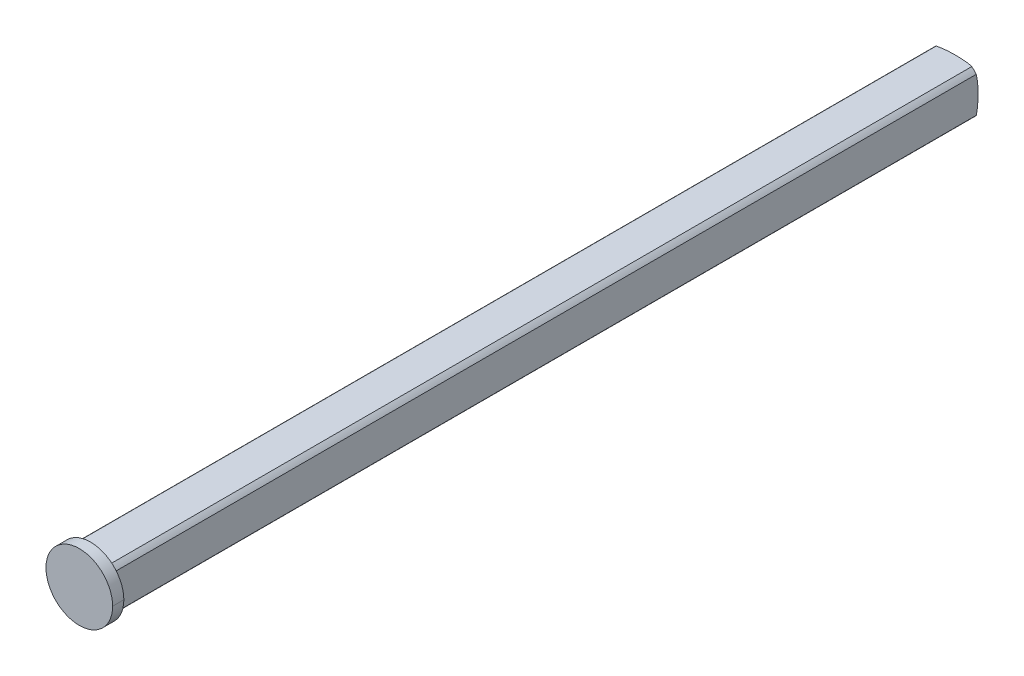
ISO-10303-21;
HEADER;
FILE_DESCRIPTION(('STEP AP214'),'2;1');
FILE_NAME('part.step','',(''),(''),'','','');
FILE_SCHEMA(('AUTOMOTIVE_DESIGN { 1 0 10303 214 1 1 1 1 }'));
ENDSEC;
DATA;
#1=APPLICATION_CONTEXT('core data for automotive mechanical design processes');
#2=APPLICATION_PROTOCOL_DEFINITION('international standard','automotive_design',2000,#1);
#3=PRODUCT_CONTEXT('',#1,'mechanical');
#4=PRODUCT('Part','Part','',(#3));
#5=PRODUCT_RELATED_PRODUCT_CATEGORY('part','',(#4));
#6=PRODUCT_DEFINITION_FORMATION('','',#4);
#7=PRODUCT_DEFINITION_CONTEXT('part definition',#1,'design');
#8=PRODUCT_DEFINITION('design','',#6,#7);
#9=PRODUCT_DEFINITION_SHAPE('','',#8);
#10=(LENGTH_UNIT() NAMED_UNIT(*) SI_UNIT(.MILLI.,.METRE.));
#11=(NAMED_UNIT(*) PLANE_ANGLE_UNIT() SI_UNIT($,.RADIAN.));
#12=(NAMED_UNIT(*) SI_UNIT($,.STERADIAN.) SOLID_ANGLE_UNIT());
#13=UNCERTAINTY_MEASURE_WITH_UNIT(LENGTH_MEASURE(1.E-05),#10,'distance_accuracy_value','');
#14=(GEOMETRIC_REPRESENTATION_CONTEXT(3) GLOBAL_UNCERTAINTY_ASSIGNED_CONTEXT((#13)) GLOBAL_UNIT_ASSIGNED_CONTEXT((#10,
#11,#12)) REPRESENTATION_CONTEXT('',''));
#15=CARTESIAN_POINT('',(0.,0.,0.));
#16=DIRECTION('',(0.,0.,1.));
#17=DIRECTION('',(1.,0.,0.));
#18=AXIS2_PLACEMENT_3D('',#15,#16,#17);
#19=CARTESIAN_POINT('',(0.,0.,-61.722));
#20=DIRECTION('',(0.,0.,1.));
#21=DIRECTION('',(1.,0.,0.));
#22=AXIS2_PLACEMENT_3D('',#19,#20,#21);
#23=CYLINDRICAL_SURFACE('',#22,2.032);
#24=DIRECTION('',(0.,0.,-1.));
#25=VECTOR('',#24,1.);
#26=CARTESIAN_POINT('',(1.5875,1.26841150657032,-61.722));
#27=LINE('',#26,#25);
#28=CARTESIAN_POINT('',(1.5875,1.26841150657032,0.));
#29=VERTEX_POINT('',#28);
#30=CARTESIAN_POINT('',(1.5875,1.26841150657032,-61.570919142098));
#31=VERTEX_POINT('',#30);
#32=EDGE_CURVE('P0_E405',#29,#31,#27,.T.);
#33=ORIENTED_EDGE('',*,*,#32,.T.);
#34=CARTESIAN_POINT('',(0.,0.,-61.570919142098));
#35=DIRECTION('',(0.,0.,1.));
#36=DIRECTION('',(1.,0.,0.));
#37=AXIS2_PLACEMENT_3D('',#34,#35,#36);
#38=CIRCLE('',#37,2.032);
#39=CARTESIAN_POINT('',(1.26841150657032,1.5875,-61.570919142098));
#40=VERTEX_POINT('',#39);
#41=EDGE_CURVE('P0_E386',#31,#40,#38,.T.);
#42=ORIENTED_EDGE('',*,*,#41,.T.);
#43=DIRECTION('',(0.,0.,1.));
#44=VECTOR('',#43,1.);
#45=CARTESIAN_POINT('',(1.26841150657032,1.5875,-61.722));
#46=LINE('',#45,#44);
#47=CARTESIAN_POINT('',(1.26841150657032,1.5875,0.));
#48=VERTEX_POINT('',#47);
#49=EDGE_CURVE('P0_E290',#40,#48,#46,.T.);
#50=ORIENTED_EDGE('',*,*,#49,.T.);
#51=CARTESIAN_POINT('',(0.,0.,0.));
#52=DIRECTION('',(0.,0.,1.));
#53=DIRECTION('',(1.,0.,0.));
#54=AXIS2_PLACEMENT_3D('',#51,#52,#53);
#55=CIRCLE('',#54,2.032);
#56=EDGE_CURVE('P0_E384',#29,#48,#55,.T.);
#57=ORIENTED_EDGE('',*,*,#56,.F.);
#58=EDGE_LOOP('',(#33,#42,#50,#57));
#59=FACE_BOUND('',#58,.T.);
#60=ADVANCED_FACE('P0_F17',(#59),#23,.T.);
#61=CARTESIAN_POINT('',(0.,0.,-61.722));
#62=DIRECTION('',(0.,0.,1.));
#63=DIRECTION('',(1.,0.,0.));
#64=AXIS2_PLACEMENT_3D('',#61,#62,#63);
#65=CYLINDRICAL_SURFACE('',#64,2.032);
#66=DIRECTION('',(0.,0.,1.));
#67=VECTOR('',#66,1.);
#68=CARTESIAN_POINT('',(-1.5875,1.26841150657032,-61.722));
#69=LINE('',#68,#67);
#70=CARTESIAN_POINT('',(-1.5875,1.26841150657032,-61.570919142098));
#71=VERTEX_POINT('',#70);
#72=CARTESIAN_POINT('',(-1.5875,1.26841150657032,0.));
#73=VERTEX_POINT('',#72);
#74=EDGE_CURVE('P0_E180',#71,#73,#69,.T.);
#75=ORIENTED_EDGE('',*,*,#74,.T.);
#76=CARTESIAN_POINT('',(0.,0.,0.));
#77=DIRECTION('',(0.,0.,1.));
#78=DIRECTION('',(1.,0.,0.));
#79=AXIS2_PLACEMENT_3D('',#76,#77,#78);
#80=CIRCLE('',#79,2.032);
#81=CARTESIAN_POINT('',(-1.26841150657032,1.5875,0.));
#82=VERTEX_POINT('',#81);
#83=EDGE_CURVE('P0_E42',#82,#73,#80,.T.);
#84=ORIENTED_EDGE('',*,*,#83,.F.);
#85=DIRECTION('',(0.,0.,-1.));
#86=VECTOR('',#85,1.);
#87=CARTESIAN_POINT('',(-1.26841150657032,1.5875,-61.722));
#88=LINE('',#87,#86);
#89=CARTESIAN_POINT('',(-1.26841150657032,1.5875,-61.570919142098));
#90=VERTEX_POINT('',#89);
#91=EDGE_CURVE('P0_E412',#82,#90,#88,.T.);
#92=ORIENTED_EDGE('',*,*,#91,.T.);
#93=CARTESIAN_POINT('',(0.,0.,-61.570919142098));
#94=DIRECTION('',(0.,0.,1.));
#95=DIRECTION('',(1.,0.,0.));
#96=AXIS2_PLACEMENT_3D('',#93,#94,#95);
#97=CIRCLE('',#96,2.032);
#98=EDGE_CURVE('P0_E325',#90,#71,#97,.T.);
#99=ORIENTED_EDGE('',*,*,#98,.T.);
#100=EDGE_LOOP('',(#75,#84,#92,#99));
#101=FACE_BOUND('',#100,.T.);
#102=ADVANCED_FACE('P0_F298',(#101),#65,.T.);
#103=CARTESIAN_POINT('',(0.,0.,-61.722));
#104=DIRECTION('',(0.,0.,1.));
#105=DIRECTION('',(1.,0.,0.));
#106=AXIS2_PLACEMENT_3D('',#103,#104,#105);
#107=CYLINDRICAL_SURFACE('',#106,2.032);
#108=DIRECTION('',(0.,0.,-1.));
#109=VECTOR('',#108,1.);
#110=CARTESIAN_POINT('',(-1.5875,-1.26841150657032,-61.722));
#111=LINE('',#110,#109);
#112=CARTESIAN_POINT('',(-1.5875,-1.26841150657032,0.));
#113=VERTEX_POINT('',#112);
#114=CARTESIAN_POINT('',(-1.5875,-1.26841150657032,-61.570919142098));
#115=VERTEX_POINT('',#114);
#116=EDGE_CURVE('P0_E160',#113,#115,#111,.T.);
#117=ORIENTED_EDGE('',*,*,#116,.T.);
#118=CARTESIAN_POINT('',(0.,0.,-61.570919142098));
#119=DIRECTION('',(0.,0.,1.));
#120=DIRECTION('',(1.,0.,0.));
#121=AXIS2_PLACEMENT_3D('',#118,#119,#120);
#122=CIRCLE('',#121,2.032);
#123=CARTESIAN_POINT('',(-1.26841150657032,-1.5875,-61.570919142098));
#124=VERTEX_POINT('',#123);
#125=EDGE_CURVE('P0_E11',#115,#124,#122,.T.);
#126=ORIENTED_EDGE('',*,*,#125,.T.);
#127=DIRECTION('',(0.,0.,1.));
#128=VECTOR('',#127,1.);
#129=CARTESIAN_POINT('',(-1.26841150657032,-1.5875,-61.722));
#130=LINE('',#129,#128);
#131=CARTESIAN_POINT('',(-1.26841150657032,-1.5875,0.));
#132=VERTEX_POINT('',#131);
#133=EDGE_CURVE('P0_E159',#124,#132,#130,.T.);
#134=ORIENTED_EDGE('',*,*,#133,.T.);
#135=CARTESIAN_POINT('',(0.,0.,0.));
#136=DIRECTION('',(0.,0.,1.));
#137=DIRECTION('',(1.,0.,0.));
#138=AXIS2_PLACEMENT_3D('',#135,#136,#137);
#139=CIRCLE('',#138,2.032);
#140=EDGE_CURVE('P0_E143',#113,#132,#139,.T.);
#141=ORIENTED_EDGE('',*,*,#140,.F.);
#142=EDGE_LOOP('',(#117,#126,#134,#141));
#143=FACE_BOUND('',#142,.T.);
#144=ADVANCED_FACE('P0_F154',(#143),#107,.T.);
#145=CARTESIAN_POINT('',(0.,0.,-61.722));
#146=DIRECTION('',(0.,0.,1.));
#147=DIRECTION('',(1.,0.,0.));
#148=AXIS2_PLACEMENT_3D('',#145,#146,#147);
#149=CYLINDRICAL_SURFACE('',#148,2.032);
#150=DIRECTION('',(0.,0.,-1.));
#151=VECTOR('',#150,1.);
#152=CARTESIAN_POINT('',(1.26841150657032,-1.5875,-61.722));
#153=LINE('',#152,#151);
#154=CARTESIAN_POINT('',(1.26841150657032,-1.5875,0.));
#155=VERTEX_POINT('',#154);
#156=CARTESIAN_POINT('',(1.26841150657032,-1.5875,-61.570919142098));
#157=VERTEX_POINT('',#156);
#158=EDGE_CURVE('P0_E356',#155,#157,#153,.T.);
#159=ORIENTED_EDGE('',*,*,#158,.T.);
#160=CARTESIAN_POINT('',(0.,0.,-61.570919142098));
#161=DIRECTION('',(0.,0.,1.));
#162=DIRECTION('',(1.,0.,0.));
#163=AXIS2_PLACEMENT_3D('',#160,#161,#162);
#164=CIRCLE('',#163,2.032);
#165=CARTESIAN_POINT('',(1.5875,-1.26841150657032,-61.570919142098));
#166=VERTEX_POINT('',#165);
#167=EDGE_CURVE('P0_E26',#157,#166,#164,.T.);
#168=ORIENTED_EDGE('',*,*,#167,.T.);
#169=DIRECTION('',(0.,0.,1.));
#170=VECTOR('',#169,1.);
#171=CARTESIAN_POINT('',(1.5875,-1.26841150657032,-61.722));
#172=LINE('',#171,#170);
#173=CARTESIAN_POINT('',(1.5875,-1.26841150657032,0.));
#174=VERTEX_POINT('',#173);
#175=EDGE_CURVE('P0_E240',#166,#174,#172,.T.);
#176=ORIENTED_EDGE('',*,*,#175,.T.);
#177=CARTESIAN_POINT('',(0.,0.,0.));
#178=DIRECTION('',(0.,0.,1.));
#179=DIRECTION('',(1.,0.,0.));
#180=AXIS2_PLACEMENT_3D('',#177,#178,#179);
#181=CIRCLE('',#180,2.032);
#182=EDGE_CURVE('P0_E125',#155,#174,#181,.T.);
#183=ORIENTED_EDGE('',*,*,#182,.F.);
#184=EDGE_LOOP('',(#159,#168,#176,#183));
#185=FACE_BOUND('',#184,.T.);
#186=ADVANCED_FACE('P0_F299',(#185),#149,.T.);
#187=CARTESIAN_POINT('',(-1.5875,1.5875,-61.722));
#188=DIRECTION('',(0.,0.,-1.));
#189=DIRECTION('',(0.,-1.,0.));
#190=AXIS2_PLACEMENT_3D('',#187,#188,#189);
#191=PLANE('',#190);
#192=CARTESIAN_POINT('',(0.,0.,-61.722));
#193=DIRECTION('',(0.,0.,1.));
#194=DIRECTION('',(1.,0.,0.));
#195=AXIS2_PLACEMENT_3D('',#192,#193,#194);
#196=CIRCLE('',#195,1.24506403026729);
#197=CARTESIAN_POINT('',(1.24506403026729,0.,-61.722));
#198=VERTEX_POINT('',#197);
#199=CARTESIAN_POINT('',(-1.24506403026729,0.,-61.722));
#200=VERTEX_POINT('',#199);
#201=EDGE_CURVE('P0_E329',#198,#200,#196,.T.);
#202=ORIENTED_EDGE('',*,*,#201,.F.);
#203=CARTESIAN_POINT('',(0.,0.,-61.722));
#204=DIRECTION('',(0.,0.,1.));
#205=DIRECTION('',(1.,0.,0.));
#206=AXIS2_PLACEMENT_3D('',#203,#204,#205);
#207=CIRCLE('',#206,1.24506403026729);
#208=EDGE_CURVE('P0_E62',#200,#198,#207,.T.);
#209=ORIENTED_EDGE('',*,*,#208,.F.);
#210=EDGE_LOOP('',(#202,#209));
#211=FACE_BOUND('',#210,.T.);
#212=ADVANCED_FACE('P0_F209',(#211),#191,.T.);
#213=CARTESIAN_POINT('',(0.,0.,-59.597));
#214=DIRECTION('',(0.,0.,1.));
#215=DIRECTION('',(1.,0.,0.));
#216=AXIS2_PLACEMENT_3D('',#213,#214,#215);
#217=DEGENERATE_TOROIDAL_SURFACE('',#216,1.24506403026729,2.125,.T.);
#218=CARTESIAN_POINT('',(-1.24506403026729,0.,-59.597));
#219=DIRECTION('',(0.,1.,0.));
#220=DIRECTION('',(-1.,0.,0.));
#221=AXIS2_PLACEMENT_3D('',#218,#219,#220);
#222=CIRCLE('',#221,2.125);
#223=CARTESIAN_POINT('',(-1.5875,0.,-61.6942273616929));
#224=VERTEX_POINT('',#223);
#225=EDGE_CURVE('P0_E330',#200,#224,#222,.T.);
#226=ORIENTED_EDGE('',*,*,#225,.F.);
#227=ORIENTED_EDGE('',*,*,#208,.T.);
#228=CARTESIAN_POINT('',(1.24506403026729,0.,-59.597));
#229=DIRECTION('',(0.,-1.,0.));
#230=DIRECTION('',(0.,0.,-1.));
#231=AXIS2_PLACEMENT_3D('',#228,#229,#230);
#232=CIRCLE('',#231,2.125);
#233=CARTESIAN_POINT('',(1.5875,0.,-61.6942273616929));
#234=VERTEX_POINT('',#233);
#235=EDGE_CURVE('P0_E241',#198,#234,#232,.T.);
#236=ORIENTED_EDGE('',*,*,#235,.T.);
#237=CARTESIAN_POINT('',(1.5875,-1.26841150657032,-61.570919142098));
#238=CARTESIAN_POINT('',(1.5875,-0.987077094955513,-61.6409306391243));
#239=CARTESIAN_POINT('',(1.5875,-0.639530459017569,-61.6701819538897));
#240=CARTESIAN_POINT('',(1.5875,-0.353837297572186,-61.6942273616929));
#241=CARTESIAN_POINT('',(1.5875,0.,-61.6942273616929));
#242=B_SPLINE_CURVE_WITH_KNOTS('',2,(#237,#238,#239,#240,#241),.UNSPECIFIED.,.F.,.F.,(3,2,3),
(0.,0.5,1.),.UNSPECIFIED.);
#243=EDGE_CURVE('P0_E108',#166,#234,#242,.T.);
#244=ORIENTED_EDGE('',*,*,#243,.F.);
#245=ORIENTED_EDGE('',*,*,#167,.F.);
#246=CARTESIAN_POINT('',(-1.26841150657032,-1.5875,-61.570919142098));
#247=CARTESIAN_POINT('',(-0.770338232200926,-1.5875,-61.6948672057821));
#248=CARTESIAN_POINT('',(0.00849337593367507,-1.5875,-61.6942236517903));
#249=CARTESIAN_POINT('',(0.775470990407875,-1.5875,-61.6935898928361));
#250=CARTESIAN_POINT('',(1.26841150657033,-1.5875,-61.570919142098));
#251=B_SPLINE_CURVE_WITH_KNOTS('',2,(#246,#247,#248,#249,#250),.UNSPECIFIED.,.F.,.F.,(3,2,3),
(0.,0.5,1.),.UNSPECIFIED.);
#252=EDGE_CURVE('P0_E249',#124,#157,#251,.T.);
#253=ORIENTED_EDGE('',*,*,#252,.F.);
#254=ORIENTED_EDGE('',*,*,#125,.F.);
#255=CARTESIAN_POINT('',(-1.5875,0.,-61.6942273616929));
#256=CARTESIAN_POINT('',(-1.5875,-0.35317995741376,-61.6942273616929));
#257=CARTESIAN_POINT('',(-1.5875,-0.639529322286499,-61.6701820494506));
#258=CARTESIAN_POINT('',(-1.5875,-0.986669843252497,-61.6410319857783));
#259=CARTESIAN_POINT('',(-1.5875,-1.26841150657032,-61.570919142098));
#260=B_SPLINE_CURVE_WITH_KNOTS('',2,(#255,#256,#257,#258,#259),.UNSPECIFIED.,.F.,.F.,(3,2,3),
(0.,0.5,1.),.UNSPECIFIED.);
#261=EDGE_CURVE('P0_E168',#224,#115,#260,.T.);
#262=ORIENTED_EDGE('',*,*,#261,.F.);
#263=EDGE_LOOP('',(#226,#227,#236,#244,#245,#253,#254,#262));
#264=FACE_BOUND('',#263,.T.);
#265=ADVANCED_FACE('P0_F19',(#264),#217,.T.);
#266=CARTESIAN_POINT('',(-1.5875,1.5875,0.));
#267=DIRECTION('',(0.,0.,-1.));
#268=DIRECTION('',(0.,-1.,0.));
#269=AXIS2_PLACEMENT_3D('',#266,#267,#268);
#270=PLANE('',#269);
#271=ORIENTED_EDGE('',*,*,#83,.T.);
#272=DIRECTION('',(0.,-1.,0.));
#273=VECTOR('',#272,1.);
#274=CARTESIAN_POINT('',(-1.5875,-1.5875,0.));
#275=LINE('',#274,#273);
#276=EDGE_CURVE('P0_E162',#73,#113,#275,.T.);
#277=ORIENTED_EDGE('',*,*,#276,.T.);
#278=ORIENTED_EDGE('',*,*,#140,.T.);
#279=DIRECTION('',(1.,0.,0.));
#280=VECTOR('',#279,1.);
#281=CARTESIAN_POINT('',(-1.5875,-1.5875,0.));
#282=LINE('',#281,#280);
#283=EDGE_CURVE('P0_E238',#132,#155,#282,.T.);
#284=ORIENTED_EDGE('',*,*,#283,.T.);
#285=ORIENTED_EDGE('',*,*,#182,.T.);
#286=DIRECTION('',(0.,1.,0.));
#287=VECTOR('',#286,1.);
#288=CARTESIAN_POINT('',(1.5875,-1.5875,0.));
#289=LINE('',#288,#287);
#290=EDGE_CURVE('P0_E404',#174,#29,#289,.T.);
#291=ORIENTED_EDGE('',*,*,#290,.T.);
#292=ORIENTED_EDGE('',*,*,#56,.T.);
#293=DIRECTION('',(-1.,0.,0.));
#294=VECTOR('',#293,1.);
#295=CARTESIAN_POINT('',(-1.5875,1.5875,0.));
#296=LINE('',#295,#294);
#297=EDGE_CURVE('P0_E416',#48,#82,#296,.T.);
#298=ORIENTED_EDGE('',*,*,#297,.T.);
#299=EDGE_LOOP('',(#271,#277,#278,#284,#285,#291,#292,#298));
#300=FACE_BOUND('',#299,.T.);
#301=ADVANCED_FACE('P0_F163',(#300),#270,.F.);
#302=CARTESIAN_POINT('',(-1.5875,1.5875,0.));
#303=DIRECTION('',(0.,-1.,0.));
#304=DIRECTION('',(0.,0.,-1.));
#305=AXIS2_PLACEMENT_3D('',#302,#303,#304);
#306=PLANE('',#305);
#307=ORIENTED_EDGE('',*,*,#49,.F.);
#308=CARTESIAN_POINT('',(1.26841150657033,1.5875,-61.570919142098));
#309=CARTESIAN_POINT('',(0.770338232200925,1.5875,-61.6948672057821));
#310=CARTESIAN_POINT('',(-0.00849337593367486,1.5875,-61.6942236517903));
#311=CARTESIAN_POINT('',(-0.775470990407872,1.5875,-61.6935898928361));
#312=CARTESIAN_POINT('',(-1.26841150657032,1.5875,-61.570919142098));
#313=B_SPLINE_CURVE_WITH_KNOTS('',2,(#308,#309,#310,#311,#312),.UNSPECIFIED.,.F.,.F.,(3,2,3),
(0.,0.5,1.),.UNSPECIFIED.);
#314=EDGE_CURVE('P0_E283',#40,#90,#313,.T.);
#315=ORIENTED_EDGE('',*,*,#314,.T.);
#316=ORIENTED_EDGE('',*,*,#91,.F.);
#317=ORIENTED_EDGE('',*,*,#297,.F.);
#318=EDGE_LOOP('',(#307,#315,#316,#317));
#319=FACE_BOUND('',#318,.T.);
#320=ADVANCED_FACE('P0_F210',(#319),#306,.F.);
#321=CARTESIAN_POINT('',(1.5875,-1.5875,0.));
#322=DIRECTION('',(-1.,0.,0.));
#323=DIRECTION('',(0.,0.,1.));
#324=AXIS2_PLACEMENT_3D('',#321,#322,#323);
#325=PLANE('',#324);
#326=ORIENTED_EDGE('',*,*,#175,.F.);
#327=ORIENTED_EDGE('',*,*,#243,.T.);
#328=CARTESIAN_POINT('',(1.5875,0.,-61.6942273616929));
#329=CARTESIAN_POINT('',(1.5875,0.35317995741354,-61.6942273616929));
#330=CARTESIAN_POINT('',(1.5875,0.6395293222865,-61.6701820494506));
#331=CARTESIAN_POINT('',(1.5875,0.986669843252375,-61.6410319857783));
#332=CARTESIAN_POINT('',(1.5875,1.26841150657033,-61.570919142098));
#333=B_SPLINE_CURVE_WITH_KNOTS('',2,(#328,#329,#330,#331,#332),.UNSPECIFIED.,.F.,.F.,(3,2,3),
(0.,0.5,1.),.UNSPECIFIED.);
#334=EDGE_CURVE('P0_E188',#234,#31,#333,.T.);
#335=ORIENTED_EDGE('',*,*,#334,.T.);
#336=ORIENTED_EDGE('',*,*,#32,.F.);
#337=ORIENTED_EDGE('',*,*,#290,.F.);
#338=EDGE_LOOP('',(#326,#327,#335,#336,#337));
#339=FACE_BOUND('',#338,.T.);
#340=ADVANCED_FACE('P0_F198',(#339),#325,.F.);
#341=CARTESIAN_POINT('',(-1.5875,-1.5875,0.));
#342=DIRECTION('',(0.,1.,0.));
#343=DIRECTION('',(1.,0.,0.));
#344=AXIS2_PLACEMENT_3D('',#341,#342,#343);
#345=PLANE('',#344);
#346=ORIENTED_EDGE('',*,*,#133,.F.);
#347=ORIENTED_EDGE('',*,*,#252,.T.);
#348=ORIENTED_EDGE('',*,*,#158,.F.);
#349=ORIENTED_EDGE('',*,*,#283,.F.);
#350=EDGE_LOOP('',(#346,#347,#348,#349));
#351=FACE_BOUND('',#350,.T.);
#352=ADVANCED_FACE('P0_F206',(#351),#345,.F.);
#353=CARTESIAN_POINT('',(-1.5875,-1.5875,0.));
#354=DIRECTION('',(1.,0.,0.));
#355=DIRECTION('',(0.,1.,0.));
#356=AXIS2_PLACEMENT_3D('',#353,#354,#355);
#357=PLANE('',#356);
#358=ORIENTED_EDGE('',*,*,#74,.F.);
#359=CARTESIAN_POINT('',(-1.5875,1.26841150657033,-61.570919142098));
#360=CARTESIAN_POINT('',(-1.5875,0.987077094928485,-61.640930639131));
#361=CARTESIAN_POINT('',(-1.5875,0.63953045901757,-61.6701819538897));
#362=CARTESIAN_POINT('',(-1.5875,0.353837297528325,-61.6942273616929));
#363=CARTESIAN_POINT('',(-1.5875,0.,-61.6942273616929));
#364=B_SPLINE_CURVE_WITH_KNOTS('',2,(#359,#360,#361,#362,#363),.UNSPECIFIED.,.F.,.F.,(3,2,3),
(0.,0.5,1.),.UNSPECIFIED.);
#365=EDGE_CURVE('P0_E323',#71,#224,#364,.T.);
#366=ORIENTED_EDGE('',*,*,#365,.T.);
#367=ORIENTED_EDGE('',*,*,#261,.T.);
#368=ORIENTED_EDGE('',*,*,#116,.F.);
#369=ORIENTED_EDGE('',*,*,#276,.F.);
#370=EDGE_LOOP('',(#358,#366,#367,#368,#369));
#371=FACE_BOUND('',#370,.T.);
#372=ADVANCED_FACE('P0_F169',(#371),#357,.F.);
#373=CARTESIAN_POINT('',(0.,0.,-59.597));
#374=DIRECTION('',(0.,0.,1.));
#375=DIRECTION('',(1.,0.,0.));
#376=AXIS2_PLACEMENT_3D('',#373,#374,#375);
#377=DEGENERATE_TOROIDAL_SURFACE('',#376,1.24506403026729,2.125,.T.);
#378=ORIENTED_EDGE('',*,*,#201,.T.);
#379=ORIENTED_EDGE('',*,*,#225,.T.);
#380=ORIENTED_EDGE('',*,*,#365,.F.);
#381=ORIENTED_EDGE('',*,*,#98,.F.);
#382=ORIENTED_EDGE('',*,*,#314,.F.);
#383=ORIENTED_EDGE('',*,*,#41,.F.);
#384=ORIENTED_EDGE('',*,*,#334,.F.);
#385=ORIENTED_EDGE('',*,*,#235,.F.);
#386=EDGE_LOOP('',(#378,#379,#380,#381,#382,#383,#384,#385));
#387=FACE_BOUND('',#386,.T.);
#388=ADVANCED_FACE('P0_F295',(#387),#377,.T.);
#389=CLOSED_SHELL('',(#60,#102,#144,#186,#212,#265,#301,#320,#340,#352,#372,#388));
#390=MANIFOLD_SOLID_BREP('P0_B1',#389);
#391=CARTESIAN_POINT('',(0.,0.,0.));
#392=DIRECTION('',(0.,0.,1.));
#393=DIRECTION('',(1.,0.,0.));
#394=AXIS2_PLACEMENT_3D('',#391,#392,#393);
#395=PLANE('',#394);
#396=CARTESIAN_POINT('',(0.,0.,0.));
#397=DIRECTION('',(0.,0.,1.));
#398=DIRECTION('',(1.,0.,0.));
#399=AXIS2_PLACEMENT_3D('',#396,#397,#398);
#400=CIRCLE('',#399,2.375);
#401=CARTESIAN_POINT('',(-2.375,0.,0.));
#402=VERTEX_POINT('',#401);
#403=CARTESIAN_POINT('',(2.375,0.,0.));
#404=VERTEX_POINT('',#403);
#405=EDGE_CURVE('P1_E10',#402,#404,#400,.T.);
#406=ORIENTED_EDGE('',*,*,#405,.F.);
#407=CARTESIAN_POINT('',(0.,0.,0.));
#408=DIRECTION('',(0.,0.,1.));
#409=DIRECTION('',(1.,0.,0.));
#410=AXIS2_PLACEMENT_3D('',#407,#408,#409);
#411=CIRCLE('',#410,2.375);
#412=EDGE_CURVE('P1_E65',#404,#402,#411,.T.);
#413=ORIENTED_EDGE('',*,*,#412,.F.);
#414=EDGE_LOOP('',(#406,#413));
#415=FACE_BOUND('',#414,.T.);
#416=ADVANCED_FACE('P1_F16',(#415),#395,.F.);
#417=CARTESIAN_POINT('',(0.,0.,0.8));
#418=DIRECTION('',(0.,0.,1.));
#419=DIRECTION('',(1.,0.,0.));
#420=AXIS2_PLACEMENT_3D('',#417,#418,#419);
#421=PLANE('',#420);
#422=CARTESIAN_POINT('',(0.,0.,0.8));
#423=DIRECTION('',(0.,0.,1.));
#424=DIRECTION('',(1.,0.,0.));
#425=AXIS2_PLACEMENT_3D('',#422,#423,#424);
#426=CIRCLE('',#425,2.375);
#427=CARTESIAN_POINT('',(-2.375,0.,0.8));
#428=VERTEX_POINT('',#427);
#429=CARTESIAN_POINT('',(2.375,0.,0.8));
#430=VERTEX_POINT('',#429);
#431=EDGE_CURVE('P1_E20',#428,#430,#426,.T.);
#432=ORIENTED_EDGE('',*,*,#431,.T.);
#433=CARTESIAN_POINT('',(0.,0.,0.8));
#434=DIRECTION('',(0.,0.,1.));
#435=DIRECTION('',(1.,0.,0.));
#436=AXIS2_PLACEMENT_3D('',#433,#434,#435);
#437=CIRCLE('',#436,2.375);
#438=EDGE_CURVE('P1_E63',#430,#428,#437,.T.);
#439=ORIENTED_EDGE('',*,*,#438,.T.);
#440=EDGE_LOOP('',(#432,#439));
#441=FACE_BOUND('',#440,.T.);
#442=ADVANCED_FACE('P1_F69',(#441),#421,.T.);
#443=CARTESIAN_POINT('',(0.,0.,0.8));
#444=DIRECTION('',(0.,0.,-1.));
#445=DIRECTION('',(-1.,0.,0.));
#446=AXIS2_PLACEMENT_3D('',#443,#444,#445);
#447=CYLINDRICAL_SURFACE('',#446,2.375);
#448=DIRECTION('',(0.,0.,-1.));
#449=VECTOR('',#448,1.);
#450=CARTESIAN_POINT('',(2.375,0.,0.8));
#451=LINE('',#450,#449);
#452=EDGE_CURVE('P1_E56',#430,#404,#451,.T.);
#453=ORIENTED_EDGE('',*,*,#452,.F.);
#454=ORIENTED_EDGE('',*,*,#431,.F.);
#455=DIRECTION('',(0.,0.,-1.));
#456=VECTOR('',#455,1.);
#457=CARTESIAN_POINT('',(-2.375,0.,0.8));
#458=LINE('',#457,#456);
#459=EDGE_CURVE('P1_E57',#428,#402,#458,.T.);
#460=ORIENTED_EDGE('',*,*,#459,.T.);
#461=ORIENTED_EDGE('',*,*,#405,.T.);
#462=EDGE_LOOP('',(#453,#454,#460,#461));
#463=FACE_BOUND('',#462,.T.);
#464=ADVANCED_FACE('P1_F18',(#463),#447,.T.);
#465=CARTESIAN_POINT('',(0.,0.,0.8));
#466=DIRECTION('',(0.,0.,-1.));
#467=DIRECTION('',(-1.,0.,0.));
#468=AXIS2_PLACEMENT_3D('',#465,#466,#467);
#469=CYLINDRICAL_SURFACE('',#468,2.375);
#470=ORIENTED_EDGE('',*,*,#438,.F.);
#471=ORIENTED_EDGE('',*,*,#452,.T.);
#472=ORIENTED_EDGE('',*,*,#412,.T.);
#473=ORIENTED_EDGE('',*,*,#459,.F.);
#474=EDGE_LOOP('',(#470,#471,#472,#473));
#475=FACE_BOUND('',#474,.T.);
#476=ADVANCED_FACE('P1_F64',(#475),#469,.T.);
#477=CLOSED_SHELL('',(#416,#442,#464,#476));
#478=MANIFOLD_SOLID_BREP('P1_B1',#477);
#479=ADVANCED_BREP_SHAPE_REPRESENTATION('',(#18,#390,#478),#14);
#480=SHAPE_DEFINITION_REPRESENTATION(#9,#479);
ENDSEC;
END-ISO-10303-21;
